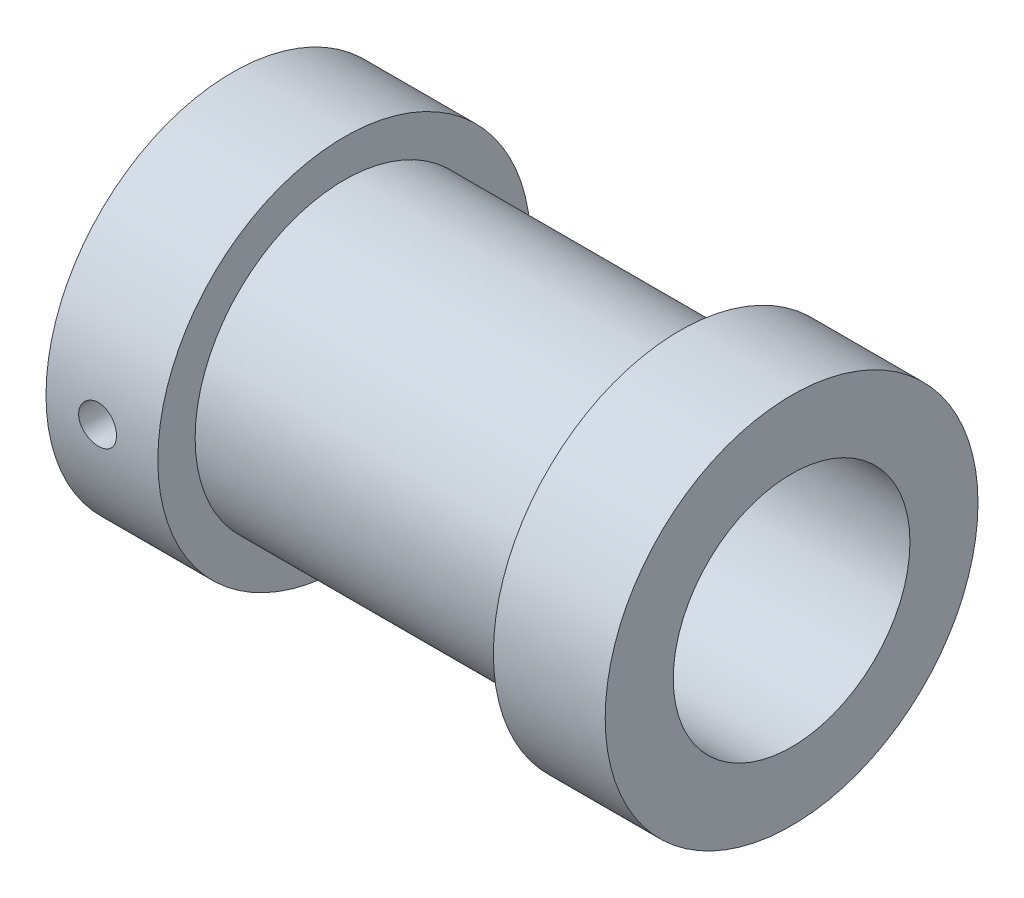
ISO-10303-21;
HEADER;
FILE_DESCRIPTION(('STEP AP214'),'2;1');
FILE_NAME('part.step','',(''),(''),'','','');
FILE_SCHEMA(('AUTOMOTIVE_DESIGN { 1 0 10303 214 1 1 1 1 }'));
ENDSEC;
DATA;
#1=APPLICATION_CONTEXT('core data for automotive mechanical design processes');
#2=APPLICATION_PROTOCOL_DEFINITION('international standard','automotive_design',2000,#1);
#3=PRODUCT_CONTEXT('',#1,'mechanical');
#4=PRODUCT('Part','Part','',(#3));
#5=PRODUCT_RELATED_PRODUCT_CATEGORY('part','',(#4));
#6=PRODUCT_DEFINITION_FORMATION('','',#4);
#7=PRODUCT_DEFINITION_CONTEXT('part definition',#1,'design');
#8=PRODUCT_DEFINITION('design','',#6,#7);
#9=PRODUCT_DEFINITION_SHAPE('','',#8);
#10=(LENGTH_UNIT() NAMED_UNIT(*) SI_UNIT(.MILLI.,.METRE.));
#11=(NAMED_UNIT(*) PLANE_ANGLE_UNIT() SI_UNIT($,.RADIAN.));
#12=(NAMED_UNIT(*) SI_UNIT($,.STERADIAN.) SOLID_ANGLE_UNIT());
#13=UNCERTAINTY_MEASURE_WITH_UNIT(LENGTH_MEASURE(1.E-05),#10,'distance_accuracy_value','');
#14=(GEOMETRIC_REPRESENTATION_CONTEXT(3) GLOBAL_UNCERTAINTY_ASSIGNED_CONTEXT((#13)) GLOBAL_UNIT_ASSIGNED_CONTEXT((#10,
#11,#12)) REPRESENTATION_CONTEXT('',''));
#15=CARTESIAN_POINT('',(0.,0.,0.));
#16=DIRECTION('',(0.,0.,1.));
#17=DIRECTION('',(1.,0.,0.));
#18=AXIS2_PLACEMENT_3D('',#15,#16,#17);
#19=CARTESIAN_POINT('',(15.,0.,0.));
#20=DIRECTION('',(-1.,0.,0.));
#21=DIRECTION('',(0.,0.,1.));
#22=AXIS2_PLACEMENT_3D('',#19,#20,#21);
#23=CYLINDRICAL_SURFACE('',#22,5.);
#24=CARTESIAN_POINT('',(1.89094283641369,0.,5.));
#25=CARTESIAN_POINT('',(1.89094160536785,-0.0284558902233107,4.99999966778207));
#26=CARTESIAN_POINT('',(1.88854382811476,-0.0569305349037627,4.99975449834205));
#27=CARTESIAN_POINT('',(1.87901491660107,-0.113090228167648,4.9988000444433));
#28=CARTESIAN_POINT('',(1.87187858314065,-0.14077437456866,4.99809025020489));
#29=CARTESIAN_POINT('',(1.85308259977297,-0.194531704455237,4.99628666051169));
#30=CARTESIAN_POINT('',(1.84142569980444,-0.220605856171556,4.99519309854781));
#31=CARTESIAN_POINT('',(1.81392485834372,-0.27042185969462,4.99274421512792));
#32=CARTESIAN_POINT('',(1.79808174284673,-0.294164170337882,4.99138894532447));
#33=CARTESIAN_POINT('',(1.76259515603343,-0.338736228986172,4.98856281285647));
#34=CARTESIAN_POINT('',(1.74293932355167,-0.359556113190216,4.98709158371012));
#35=CARTESIAN_POINT('',(1.70041163724327,-0.397607530682625,4.98420237531753));
#36=CARTESIAN_POINT('',(1.67753963392158,-0.414838897075972,4.98278439855048));
#37=CARTESIAN_POINT('',(1.62916698059483,-0.445259186141867,4.98015850464142));
#38=CARTESIAN_POINT('',(1.60366067795446,-0.458439164106136,4.97895105480937));
#39=CARTESIAN_POINT('',(1.55078263221904,-0.480325429635348,4.97688748539026));
#40=CARTESIAN_POINT('',(1.52341093663097,-0.489031831083169,4.9760313568598));
#41=CARTESIAN_POINT('',(1.46767979325004,-0.501694514664533,4.97477068646122));
#42=CARTESIAN_POINT('',(1.43932410244677,-0.505667174519257,4.97436458793014));
#43=CARTESIAN_POINT('',(1.38234574890266,-0.508800235222817,4.97404512800764));
#44=CARTESIAN_POINT('',(1.3537230934123,-0.507960766386188,4.97413175327304));
#45=CARTESIAN_POINT('',(1.29713627070867,-0.50150689501049,4.97478653178862));
#46=CARTESIAN_POINT('',(1.26917003912877,-0.495910383804106,4.97535288076052));
#47=CARTESIAN_POINT('',(1.21457584952033,-0.480129134957687,4.97690047508911));
#48=CARTESIAN_POINT('',(1.18794791010035,-0.469944333538373,4.97788172621313));
#49=CARTESIAN_POINT('',(1.13672971090345,-0.445255894729308,4.98015063665103));
#50=CARTESIAN_POINT('',(1.11214329869818,-0.430744328946903,4.98143885758074));
#51=CARTESIAN_POINT('',(1.06574817859489,-0.397819987217542,4.98417608454012));
#52=CARTESIAN_POINT('',(1.04393955466384,-0.379407093386045,4.98562509542768));
#53=CARTESIAN_POINT('',(1.00361511881581,-0.339102886954549,4.98852867357586));
#54=CARTESIAN_POINT('',(0.985114744976072,-0.317196124674252,4.98998323611045));
#55=CARTESIAN_POINT('',(0.95205165551659,-0.270579655416264,4.99272780011116));
#56=CARTESIAN_POINT('',(0.937488944530608,-0.245869945140166,4.99401780138361));
#57=CARTESIAN_POINT('',(0.91271514583764,-0.194338232384778,4.99628833807862));
#58=CARTESIAN_POINT('',(0.902504851947502,-0.167515845640379,4.99726881704041));
#59=CARTESIAN_POINT('',(0.886737088655384,-0.112525259039199,4.99880926287826));
#60=CARTESIAN_POINT('',(0.881179475611196,-0.0843571007588045,4.99936924273632));
#61=CARTESIAN_POINT('',(0.87489444373559,-0.0276082441555205,5.00000392655833));
#62=CARTESIAN_POINT('',(0.874145723609797,0.00097007207230486,5.00008077057094));
#63=CARTESIAN_POINT('',(0.877443768328665,0.0578453802732921,4.99974626506163));
#64=CARTESIAN_POINT('',(0.881490466260006,0.0861423761663281,4.99933492235166));
#65=CARTESIAN_POINT('',(0.894246802942073,0.141590235302855,4.99807163430661));
#66=CARTESIAN_POINT('',(0.902946457430105,0.168743418842069,4.99722063251971));
#67=CARTESIAN_POINT('',(0.924751488427032,0.221205025140725,4.9951734855702));
#68=CARTESIAN_POINT('',(0.937856966724328,0.246513405262962,4.99397733243358));
#69=CARTESIAN_POINT('',(0.968154381840023,0.294663235162119,4.99136832290633));
#70=CARTESIAN_POINT('',(0.985360301463595,0.317495846013096,4.98995473101349));
#71=CARTESIAN_POINT('',(1.02335015268861,0.359956505245795,4.98707179557619));
#72=CARTESIAN_POINT('',(1.04413417704436,0.379584470528583,4.98560245058722));
#73=CARTESIAN_POINT('',(1.08878325144959,0.415152726663468,4.98276716529132));
#74=CARTESIAN_POINT('',(1.11265947413598,0.431079029268025,4.98140162993782));
#75=CARTESIAN_POINT('',(1.16276013097058,0.458695681777094,4.97893475818123));
#76=CARTESIAN_POINT('',(1.1889845321078,0.470386091218659,4.97783341806485));
#77=CARTESIAN_POINT('',(1.24298932250056,0.489175736089753,4.97602217148295));
#78=CARTESIAN_POINT('',(1.27076680001536,0.496283269386568,4.97531155790405));
#79=CARTESIAN_POINT('',(1.3271285060542,0.505732317657743,4.97436003289928));
#80=CARTESIAN_POINT('',(1.35571271060093,0.5080739741312,4.97411910752835));
#81=CARTESIAN_POINT('',(1.41273742929163,0.507922797591637,4.97413453621909));
#82=CARTESIAN_POINT('',(1.44117800485078,0.505451938281612,4.97438863004946));
#83=CARTESIAN_POINT('',(1.49723778355729,0.495791967676261,4.97536064528583));
#84=CARTESIAN_POINT('',(1.52485698582061,0.488602851302961,4.97607856719101));
#85=CARTESIAN_POINT('',(1.57848968574253,0.469716549700119,4.97789671537089));
#86=CARTESIAN_POINT('',(1.60450342107146,0.45802003360379,4.9789968848977));
#87=CARTESIAN_POINT('',(1.65420198804803,0.430453211643817,4.9814556798073));
#88=CARTESIAN_POINT('',(1.67788683027774,0.414582924746241,4.98281430401562));
#89=CARTESIAN_POINT('',(1.7223678902295,0.379036585514296,4.98564435674061));
#90=CARTESIAN_POINT('',(1.74315099117767,0.359344156287213,4.98711625360877));
#91=CARTESIAN_POINT('',(1.78112727971285,0.316745088706247,4.99000273597694));
#92=CARTESIAN_POINT('',(1.7983196070609,0.29383768233533,4.99141730767834));
#93=CARTESIAN_POINT('',(1.82866153643022,0.24539380547001,4.99403357869966));
#94=CARTESIAN_POINT('',(1.84180055568668,0.219850681322135,4.99523471736271));
#95=CARTESIAN_POINT('',(1.86358540440783,0.166924722798574,4.99728272287539));
#96=CARTESIAN_POINT('',(1.8722362894683,0.13954399781512,4.99812998813));
#97=CARTESIAN_POINT('',(1.88264711851977,0.0933408375565534,4.99916238575075));
#98=CARTESIAN_POINT('',(1.88575374970988,0.0748135423836169,4.99947502264549));
#99=CARTESIAN_POINT('',(1.88990201018255,0.037526883415308,4.99989393888129));
#100=CARTESIAN_POINT('',(1.89094364832567,0.0187675206160475,5.00000021910779));
#101=CARTESIAN_POINT('',(1.89094283641369,0.,5.));
#102=B_SPLINE_CURVE_WITH_KNOTS('',3,(#24,#25,#26,#27,#28,#29,#30,#31,#32,#33,#34,#35,#36,#37,
#38,#39,#40,#41,#42,#43,#44,#45,#46,#47,#48,#49,#50,#51,#52,#53,#54,#55,#56,#57,#58,#59,#60,#61,
#62,#63,#64,#65,#66,#67,#68,#69,#70,#71,#72,#73,#74,#75,#76,#77,#78,#79,#80,#81,#82,#83,#84,#85,
#86,#87,#88,#89,#90,#91,#92,#93,#94,#95,#96,#97,#98,#99,#100,#101),.UNSPECIFIED.,.T.,.F.,(4,2,2,
2,2,2,2,2,2,2,2,2,2,2,2,2,2,2,2,2,2,2,2,2,2,2,2,2,2,2,2,2,2,2,2,2,2,2,4),(0.,0.0852991375810336,
0.170692021377233,0.256033040485045,0.341357233249468,0.426962823226226,0.51257239366462,
0.598369638519143,0.684164699143363,0.769662057491917,0.855157100545809,0.940332010575839,
1.02550810461163,1.1108412452777,1.19617696478176,1.28190106665662,1.36762526940953,
1.45336510031336,1.53910228407389,1.62445942612405,1.70981537714929,1.79498890285023,
1.88016439646298,1.96563460905525,2.05110703760429,2.1368973896773,2.22268653588823,
2.30831991072574,2.39395074306741,2.47919150582974,2.56443236033172,2.64966056551667,
2.73488838342211,2.82048978046727,2.90611166151184,2.99195523646691,3.07770190302607,
3.13395950662116,3.19021686882351),.UNSPECIFIED.);
#103=CARTESIAN_POINT('',(1.89094283641369,0.,5.));
#104=VERTEX_POINT('',#103);
#105=EDGE_CURVE('E36',#104,#104,#102,.T.);
#106=ORIENTED_EDGE('',*,*,#105,.T.);
#107=EDGE_LOOP('',(#106));
#108=FACE_BOUND('',#107,.T.);
#109=CARTESIAN_POINT('',(3.,0.,0.));
#110=DIRECTION('',(1.,0.,0.));
#111=DIRECTION('',(0.,0.,-1.));
#112=AXIS2_PLACEMENT_3D('',#109,#110,#111);
#113=CIRCLE('',#112,5.);
#114=CARTESIAN_POINT('',(3.,0.,-5.));
#115=VERTEX_POINT('',#114);
#116=EDGE_CURVE('E64',#115,#115,#113,.T.);
#117=ORIENTED_EDGE('',*,*,#116,.F.);
#118=EDGE_LOOP('',(#117));
#119=FACE_BOUND('',#118,.T.);
#120=CARTESIAN_POINT('',(0.,0.,0.));
#121=DIRECTION('',(1.,0.,0.));
#122=DIRECTION('',(0.,0.,-1.));
#123=AXIS2_PLACEMENT_3D('',#120,#121,#122);
#124=CIRCLE('',#123,5.);
#125=CARTESIAN_POINT('',(0.,0.,-5.));
#126=VERTEX_POINT('',#125);
#127=EDGE_CURVE('E43',#126,#126,#124,.T.);
#128=ORIENTED_EDGE('',*,*,#127,.T.);
#129=EDGE_LOOP('',(#128));
#130=FACE_BOUND('',#129,.T.);
#131=ADVANCED_FACE('F31',(#108,#119,#130),#23,.T.);
#132=CARTESIAN_POINT('',(15.,0.,0.));
#133=DIRECTION('',(1.,0.,0.));
#134=DIRECTION('',(0.,0.,-1.));
#135=AXIS2_PLACEMENT_3D('',#132,#133,#134);
#136=PLANE('',#135);
#137=CARTESIAN_POINT('',(15.,0.,0.));
#138=DIRECTION('',(1.,0.,0.));
#139=DIRECTION('',(0.,0.,-1.));
#140=AXIS2_PLACEMENT_3D('',#137,#138,#139);
#141=CIRCLE('',#140,5.);
#142=CARTESIAN_POINT('',(15.,0.,-5.));
#143=VERTEX_POINT('',#142);
#144=EDGE_CURVE('E10',#143,#143,#141,.T.);
#145=ORIENTED_EDGE('',*,*,#144,.T.);
#146=EDGE_LOOP('',(#145));
#147=FACE_BOUND('',#146,.T.);
#148=CARTESIAN_POINT('',(15.,0.,0.));
#149=DIRECTION('',(1.,0.,0.));
#150=DIRECTION('',(0.,0.,-1.));
#151=AXIS2_PLACEMENT_3D('',#148,#149,#150);
#152=CIRCLE('',#151,3.175);
#153=CARTESIAN_POINT('',(15.,0.,-3.175));
#154=VERTEX_POINT('',#153);
#155=EDGE_CURVE('E48',#154,#154,#152,.T.);
#156=ORIENTED_EDGE('',*,*,#155,.F.);
#157=EDGE_LOOP('',(#156));
#158=FACE_BOUND('',#157,.T.);
#159=ADVANCED_FACE('F99',(#147,#158),#136,.T.);
#160=CARTESIAN_POINT('',(0.,0.,0.));
#161=DIRECTION('',(1.,0.,0.));
#162=DIRECTION('',(0.,0.,-1.));
#163=AXIS2_PLACEMENT_3D('',#160,#161,#162);
#164=PLANE('',#163);
#165=ORIENTED_EDGE('',*,*,#127,.F.);
#166=EDGE_LOOP('',(#165));
#167=FACE_BOUND('',#166,.T.);
#168=CARTESIAN_POINT('',(0.,0.,0.));
#169=DIRECTION('',(1.,0.,0.));
#170=DIRECTION('',(0.,0.,-1.));
#171=AXIS2_PLACEMENT_3D('',#168,#169,#170);
#172=CIRCLE('',#171,3.175);
#173=CARTESIAN_POINT('',(0.,0.,-3.175));
#174=VERTEX_POINT('',#173);
#175=EDGE_CURVE('E50',#174,#174,#172,.T.);
#176=ORIENTED_EDGE('',*,*,#175,.T.);
#177=EDGE_LOOP('',(#176));
#178=FACE_BOUND('',#177,.T.);
#179=ADVANCED_FACE('F104',(#167,#178),#164,.F.);
#180=CARTESIAN_POINT('',(12.,0.,0.));
#181=DIRECTION('',(1.,0.,0.));
#182=DIRECTION('',(0.,0.,-1.));
#183=AXIS2_PLACEMENT_3D('',#180,#181,#182);
#184=CIRCLE('',#183,5.);
#185=CARTESIAN_POINT('',(12.,0.,-5.));
#186=VERTEX_POINT('',#185);
#187=EDGE_CURVE('E61',#186,#186,#184,.T.);
#188=ORIENTED_EDGE('',*,*,#187,.T.);
#189=EDGE_LOOP('',(#188));
#190=FACE_BOUND('',#189,.T.);
#191=ORIENTED_EDGE('',*,*,#144,.F.);
#192=EDGE_LOOP('',(#191));
#193=FACE_BOUND('',#192,.T.);
#194=ADVANCED_FACE('F33',(#190,#193),#23,.T.);
#195=CARTESIAN_POINT('',(15.,0.,0.));
#196=DIRECTION('',(-1.,0.,0.));
#197=DIRECTION('',(0.,0.,1.));
#198=AXIS2_PLACEMENT_3D('',#195,#196,#197);
#199=CYLINDRICAL_SURFACE('',#198,3.175);
#200=CARTESIAN_POINT('',(1.89094283641369,0.,3.175));
#201=CARTESIAN_POINT('',(1.89094168614163,-0.0283405631124949,3.17499952608933));
#202=CARTESIAN_POINT('',(1.88856321016123,-0.0566969970605244,3.17461657877987));
#203=CARTESIAN_POINT('',(1.87911546669841,-0.112615670033191,3.17312579348315));
#204=CARTESIAN_POINT('',(1.87204178102306,-0.140177135478333,3.17201727274485));
#205=CARTESIAN_POINT('',(1.85342173278041,-0.193688657866075,3.16919977385927));
#206=CARTESIAN_POINT('',(1.84187891469901,-0.219639972947776,3.16749127165919));
#207=CARTESIAN_POINT('',(1.81465729063666,-0.269233864463745,3.16366204909493));
#208=CARTESIAN_POINT('',(1.79897899928925,-0.292876727669026,3.16154138003097));
#209=CARTESIAN_POINT('',(1.76378393293104,-0.337395183995869,3.15710225297458));
#210=CARTESIAN_POINT('',(1.74423777576162,-0.358247408097593,3.15478236312531));
#211=CARTESIAN_POINT('',(1.70192506172585,-0.396390902120805,3.15021732136983));
#212=CARTESIAN_POINT('',(1.67915830934385,-0.413681955694397,3.1479721740113));
#213=CARTESIAN_POINT('',(1.63089156933107,-0.444304840149559,3.14379694728862));
#214=CARTESIAN_POINT('',(1.60537687532385,-0.457613765609081,3.14186871840518));
#215=CARTESIAN_POINT('',(1.55243813804502,-0.479748166645016,3.13856539151186));
#216=CARTESIAN_POINT('',(1.52501421352578,-0.488573920787739,3.13719025913587));
#217=CARTESIAN_POINT('',(1.46928242069003,-0.501418247050567,3.1351630076456));
#218=CARTESIAN_POINT('',(1.44098404343239,-0.505477029304012,3.13450484426292));
#219=CARTESIAN_POINT('',(1.384100825694,-0.50879682679744,3.13396774058414));
#220=CARTESIAN_POINT('',(1.35551600402477,-0.508058155063244,3.13408874944836));
#221=CARTESIAN_POINT('',(1.29915711866697,-0.501836809527657,3.13509079560734));
#222=CARTESIAN_POINT('',(1.27137793956399,-0.496399146205088,3.13596462161109));
#223=CARTESIAN_POINT('',(1.21713136435482,-0.48100473652515,3.13836256553241));
#224=CARTESIAN_POINT('',(1.19066401003717,-0.471047846309002,3.13988670415104));
#225=CARTESIAN_POINT('',(1.13965674237831,-0.4468515034179,3.14342140383957));
#226=CARTESIAN_POINT('',(1.11512592229361,-0.43259320597647,3.14543409756395));
#227=CARTESIAN_POINT('',(1.06878794740562,-0.400212185686198,3.14971762261191));
#228=CARTESIAN_POINT('',(1.04698099573441,-0.382089174899459,3.15198847316338));
#229=CARTESIAN_POINT('',(1.00644910110261,-0.342247179583242,3.15656420362945));
#230=CARTESIAN_POINT('',(0.987762141618228,-0.320489543285818,3.15886917628689));
#231=CARTESIAN_POINT('',(0.954298852747576,-0.27412705516885,3.16322945479505));
#232=CARTESIAN_POINT('',(0.939522545031503,-0.249522187572958,3.16528475926225));
#233=CARTESIAN_POINT('',(0.914297170172749,-0.198129115630514,3.16891671447658));
#234=CARTESIAN_POINT('',(0.903851283227409,-0.171339323925067,3.17049301322294));
#235=CARTESIAN_POINT('',(0.887617599500494,-0.1163548178207,3.17298648000775));
#236=CARTESIAN_POINT('',(0.881829443941686,-0.0881602118099643,3.17390369881342));
#237=CARTESIAN_POINT('',(0.87512661303041,-0.0314939820720997,3.17496887599585));
#238=CARTESIAN_POINT('',(0.874159763060456,-0.00302867914975093,3.17512506951762));
#239=CARTESIAN_POINT('',(0.876988141342454,0.0536573403638301,3.1746730956737));
#240=CARTESIAN_POINT('',(0.880783201189984,0.0818780655689888,3.17406495533859));
#241=CARTESIAN_POINT('',(0.892984278153768,0.137113974751818,3.17215774038694));
#242=CARTESIAN_POINT('',(0.901364634041056,0.164134971298128,3.17086251221849));
#243=CARTESIAN_POINT('',(0.922471181420333,0.216388439608841,3.16772581121531));
#244=CARTESIAN_POINT('',(0.935197600825978,0.241620817491761,3.16588430973391));
#245=CARTESIAN_POINT('',(0.964755712236742,0.289808577386731,3.1618390446568));
#246=CARTESIAN_POINT('',(0.981620203963561,0.312743596786306,3.15963243499811));
#247=CARTESIAN_POINT('',(1.01893039562178,0.355476595724399,3.15511077235081));
#248=CARTESIAN_POINT('',(1.03937633409628,0.375274366138315,3.15279571214638));
#249=CARTESIAN_POINT('',(1.0835023349921,0.411362820986198,3.14829165293607));
#250=CARTESIAN_POINT('',(1.10721130222555,0.427618366033385,3.1461040619926));
#251=CARTESIAN_POINT('',(1.15705397681826,0.4559160025937,3.14212836216643));
#252=CARTESIAN_POINT('',(1.18318761178908,0.467958219844537,3.14034024136298));
#253=CARTESIAN_POINT('',(1.23703684405512,0.487434022219547,3.13737635466014));
#254=CARTESIAN_POINT('',(1.26474582988156,0.494885509852386,3.13619821292815));
#255=CARTESIAN_POINT('',(1.32104241919167,0.505024945128323,3.13458156984063));
#256=CARTESIAN_POINT('',(1.34962995264357,0.507713271461069,3.13414300968566));
#257=CARTESIAN_POINT('',(1.4065215277466,0.508240148410716,3.13405758146766));
#258=CARTESIAN_POINT('',(1.4348250591768,0.506133983466469,3.134401688567));
#259=CARTESIAN_POINT('',(1.49066965236101,0.497250765651352,3.13582311177586));
#260=CARTESIAN_POINT('',(1.51821071604552,0.490473724607765,3.1369004260288));
#261=CARTESIAN_POINT('',(1.57172969531788,0.472461645511856,3.1396635602895));
#262=CARTESIAN_POINT('',(1.59770912205459,0.461230999736135,3.14134878061482));
#263=CARTESIAN_POINT('',(1.64742401120266,0.434636106301974,3.14513848409216));
#264=CARTESIAN_POINT('',(1.67115937667701,0.419271680186244,3.14724298534374));
#265=CARTESIAN_POINT('',(1.71599235594618,0.384646585543175,3.15166290691561));
#266=CARTESIAN_POINT('',(1.7370582693804,0.365345128035632,3.15398038295322));
#267=CARTESIAN_POINT('',(1.77567138328866,0.323480009269196,3.15854842330138));
#268=CARTESIAN_POINT('',(1.79321776850347,0.300915594261088,3.16079897200637));
#269=CARTESIAN_POINT('',(1.82439419282133,0.25299628003064,3.16499597029804));
#270=CARTESIAN_POINT('',(1.83799879038109,0.227624652647888,3.16694040893851));
#271=CARTESIAN_POINT('',(1.86073240481006,0.174936192410036,3.17028649026189));
#272=CARTESIAN_POINT('',(1.8698659527621,0.147621361147276,3.17168868216832));
#273=CARTESIAN_POINT('',(1.8813786540525,0.100161221784861,3.17348045997683));
#274=CARTESIAN_POINT('',(1.88495958772306,0.0803055232846664,3.17404729116926));
#275=CARTESIAN_POINT('',(1.88974206992105,0.0403025559585319,3.17480722687054));
#276=CARTESIAN_POINT('',(1.8909436544662,0.0201552915508617,3.17500033703663));
#277=CARTESIAN_POINT('',(1.89094283641369,0.,3.175));
#278=B_SPLINE_CURVE_WITH_KNOTS('',3,(#200,#201,#202,#203,#204,#205,#206,#207,#208,#209,#210,
#211,#212,#213,#214,#215,#216,#217,#218,#219,#220,#221,#222,#223,#224,#225,#226,#227,#228,#229,
#230,#231,#232,#233,#234,#235,#236,#237,#238,#239,#240,#241,#242,#243,#244,#245,#246,#247,#248,
#249,#250,#251,#252,#253,#254,#255,#256,#257,#258,#259,#260,#261,#262,#263,#264,#265,#266,#267,
#268,#269,#270,#271,#272,#273,#274,#275,#276,#277),.UNSPECIFIED.,.T.,.F.,(4,2,2,2,2,2,2,2,2,2,2,
2,2,2,2,2,2,2,2,2,2,2,2,2,2,2,2,2,2,2,2,2,2,2,2,2,2,2,4),(0.,0.0849480258422272,
0.169976101327143,0.254936878404839,0.33988708763392,0.42550926990491,0.511136652353248,
0.597247496449895,0.683352989308903,0.768726830512903,0.854095101273038,0.93865460196186,
1.02321679458896,1.10815497715352,1.1930994901932,1.27901271587696,1.36492641762384,
1.45090310183547,1.53687316277328,1.62191083326127,1.70694549648605,1.79150906677668,
1.87607707238051,1.96133836658095,2.04660534179069,2.13268312879995,2.21875834678358,
2.30449573583118,2.39022630812054,2.47497335038918,2.55972017806775,2.64438363295635,
2.72905074339376,2.81464418236925,2.9002574252666,2.98641152437157,3.0724781308849,
3.13289253194173,3.19330601846012),.UNSPECIFIED.);
#279=CARTESIAN_POINT('',(1.89094283641369,0.,3.175));
#280=VERTEX_POINT('',#279);
#281=EDGE_CURVE('E67',#280,#280,#278,.T.);
#282=ORIENTED_EDGE('',*,*,#281,.F.);
#283=EDGE_LOOP('',(#282));
#284=FACE_BOUND('',#283,.T.);
#285=ORIENTED_EDGE('',*,*,#155,.T.);
#286=EDGE_LOOP('',(#285));
#287=FACE_BOUND('',#286,.T.);
#288=ORIENTED_EDGE('',*,*,#175,.F.);
#289=EDGE_LOOP('',(#288));
#290=FACE_BOUND('',#289,.T.);
#291=ADVANCED_FACE('F72',(#284,#287,#290),#199,.F.);
#292=CARTESIAN_POINT('',(3.,5.,0.));
#293=DIRECTION('',(-1.,0.,0.));
#294=DIRECTION('',(0.,0.,1.));
#295=AXIS2_PLACEMENT_3D('',#292,#293,#294);
#296=PLANE('',#295);
#297=CARTESIAN_POINT('',(3.,0.,0.));
#298=DIRECTION('',(1.,0.,0.));
#299=DIRECTION('',(0.,0.,-1.));
#300=AXIS2_PLACEMENT_3D('',#297,#298,#299);
#301=CIRCLE('',#300,4.);
#302=CARTESIAN_POINT('',(3.,0.,-4.));
#303=VERTEX_POINT('',#302);
#304=EDGE_CURVE('E53',#303,#303,#301,.T.);
#305=ORIENTED_EDGE('',*,*,#304,.F.);
#306=EDGE_LOOP('',(#305));
#307=FACE_BOUND('',#306,.T.);
#308=ORIENTED_EDGE('',*,*,#116,.T.);
#309=EDGE_LOOP('',(#308));
#310=FACE_BOUND('',#309,.T.);
#311=ADVANCED_FACE('F88',(#307,#310),#296,.F.);
#312=CARTESIAN_POINT('',(15.,0.,0.));
#313=DIRECTION('',(1.,0.,0.));
#314=DIRECTION('',(0.,0.,-1.));
#315=AXIS2_PLACEMENT_3D('',#312,#313,#314);
#316=CYLINDRICAL_SURFACE('',#315,4.);
#317=CARTESIAN_POINT('',(12.,0.,0.));
#318=DIRECTION('',(1.,0.,0.));
#319=DIRECTION('',(0.,0.,-1.));
#320=AXIS2_PLACEMENT_3D('',#317,#318,#319);
#321=CIRCLE('',#320,4.);
#322=CARTESIAN_POINT('',(12.,0.,-4.));
#323=VERTEX_POINT('',#322);
#324=EDGE_CURVE('E58',#323,#323,#321,.T.);
#325=ORIENTED_EDGE('',*,*,#324,.F.);
#326=EDGE_LOOP('',(#325));
#327=FACE_BOUND('',#326,.T.);
#328=ORIENTED_EDGE('',*,*,#304,.T.);
#329=EDGE_LOOP('',(#328));
#330=FACE_BOUND('',#329,.T.);
#331=ADVANCED_FACE('F85',(#327,#330),#316,.T.);
#332=CARTESIAN_POINT('',(12.,5.,0.));
#333=DIRECTION('',(1.,0.,0.));
#334=DIRECTION('',(0.,0.,-1.));
#335=AXIS2_PLACEMENT_3D('',#332,#333,#334);
#336=PLANE('',#335);
#337=ORIENTED_EDGE('',*,*,#187,.F.);
#338=EDGE_LOOP('',(#337));
#339=FACE_BOUND('',#338,.T.);
#340=ORIENTED_EDGE('',*,*,#324,.T.);
#341=EDGE_LOOP('',(#340));
#342=FACE_BOUND('',#341,.T.);
#343=ADVANCED_FACE('F80',(#339,#342),#336,.F.);
#344=CARTESIAN_POINT('',(1.3829428364137,0.,0.));
#345=DIRECTION('',(0.,0.,-1.));
#346=DIRECTION('',(-1.,0.,0.));
#347=AXIS2_PLACEMENT_3D('',#344,#345,#346);
#348=CYLINDRICAL_SURFACE('',#347,0.507999999999995);
#349=ORIENTED_EDGE('',*,*,#281,.T.);
#350=EDGE_LOOP('',(#349));
#351=FACE_BOUND('',#350,.T.);
#352=ORIENTED_EDGE('',*,*,#105,.F.);
#353=EDGE_LOOP('',(#352));
#354=FACE_BOUND('',#353,.T.);
#355=ADVANCED_FACE('F76',(#351,#354),#348,.F.);
#356=CLOSED_SHELL('',(#131,#159,#179,#194,#291,#311,#331,#343,#355));
#357=MANIFOLD_SOLID_BREP('B2',#356);
#358=ADVANCED_BREP_SHAPE_REPRESENTATION('',(#18,#357),#14);
#359=SHAPE_DEFINITION_REPRESENTATION(#9,#358);
ENDSEC;
END-ISO-10303-21;
